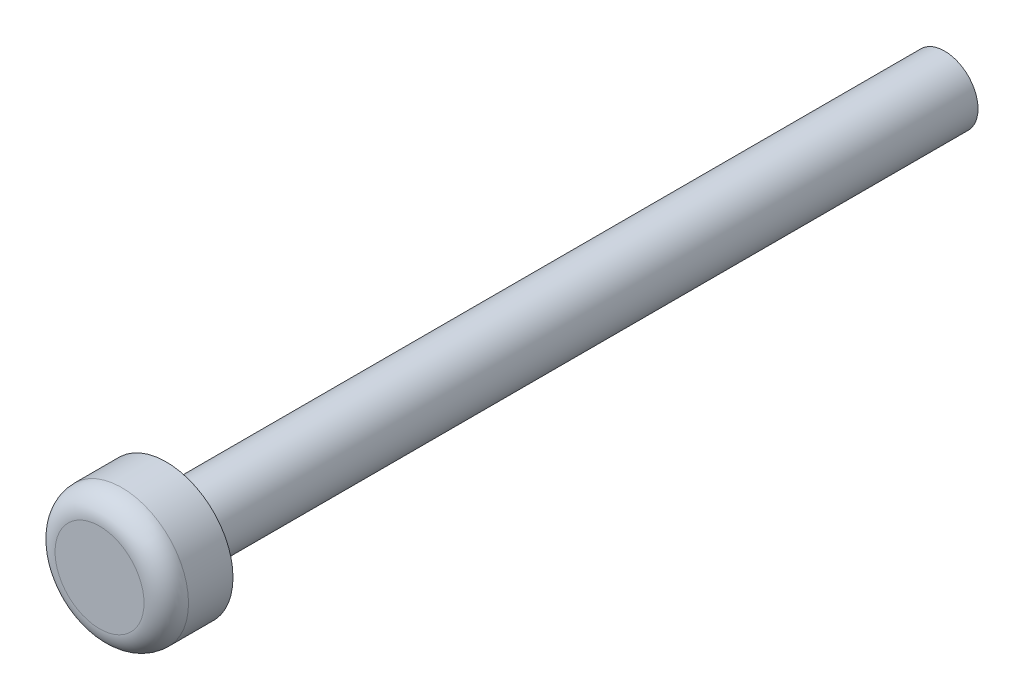
ISO-10303-21;
HEADER;
FILE_DESCRIPTION(('STEP AP214'),'2;1');
FILE_NAME('part.step','',(''),(''),'','','');
FILE_SCHEMA(('AUTOMOTIVE_DESIGN { 1 0 10303 214 1 1 1 1 }'));
ENDSEC;
DATA;
#1=APPLICATION_CONTEXT('core data for automotive mechanical design processes');
#2=APPLICATION_PROTOCOL_DEFINITION('international standard','automotive_design',2000,#1);
#3=PRODUCT_CONTEXT('',#1,'mechanical');
#4=PRODUCT('Part','Part','',(#3));
#5=PRODUCT_RELATED_PRODUCT_CATEGORY('part','',(#4));
#6=PRODUCT_DEFINITION_FORMATION('','',#4);
#7=PRODUCT_DEFINITION_CONTEXT('part definition',#1,'design');
#8=PRODUCT_DEFINITION('design','',#6,#7);
#9=PRODUCT_DEFINITION_SHAPE('','',#8);
#10=(LENGTH_UNIT() NAMED_UNIT(*) SI_UNIT(.MILLI.,.METRE.));
#11=(NAMED_UNIT(*) PLANE_ANGLE_UNIT() SI_UNIT($,.RADIAN.));
#12=(NAMED_UNIT(*) SI_UNIT($,.STERADIAN.) SOLID_ANGLE_UNIT());
#13=UNCERTAINTY_MEASURE_WITH_UNIT(LENGTH_MEASURE(1.E-05),#10,'distance_accuracy_value','');
#14=(GEOMETRIC_REPRESENTATION_CONTEXT(3) GLOBAL_UNCERTAINTY_ASSIGNED_CONTEXT((#13)) GLOBAL_UNIT_ASSIGNED_CONTEXT((#10,
#11,#12)) REPRESENTATION_CONTEXT('',''));
#15=CARTESIAN_POINT('',(0.,0.,0.));
#16=DIRECTION('',(0.,0.,1.));
#17=DIRECTION('',(1.,0.,0.));
#18=AXIS2_PLACEMENT_3D('',#15,#16,#17);
#19=CARTESIAN_POINT('',(0.,0.,-35.));
#20=DIRECTION('',(0.,0.,1.));
#21=DIRECTION('',(1.,0.,0.));
#22=AXIS2_PLACEMENT_3D('',#19,#20,#21);
#23=CYLINDRICAL_SURFACE('',#22,1.5);
#24=CARTESIAN_POINT('',(0.,0.,-35.));
#25=DIRECTION('',(0.,0.,1.));
#26=DIRECTION('',(1.,0.,0.));
#27=AXIS2_PLACEMENT_3D('',#24,#25,#26);
#28=CIRCLE('',#27,1.5);
#29=CARTESIAN_POINT('',(1.5,0.,-35.));
#30=VERTEX_POINT('',#29);
#31=EDGE_CURVE('E42',#30,#30,#28,.T.);
#32=ORIENTED_EDGE('',*,*,#31,.T.);
#33=EDGE_LOOP('',(#32));
#34=FACE_BOUND('',#33,.T.);
#35=CARTESIAN_POINT('',(0.,0.,0.));
#36=DIRECTION('',(0.,0.,1.));
#37=DIRECTION('',(1.,0.,0.));
#38=AXIS2_PLACEMENT_3D('',#35,#36,#37);
#39=CIRCLE('',#38,1.5);
#40=CARTESIAN_POINT('',(1.5,0.,0.));
#41=VERTEX_POINT('',#40);
#42=EDGE_CURVE('E46',#41,#41,#39,.T.);
#43=ORIENTED_EDGE('',*,*,#42,.F.);
#44=EDGE_LOOP('',(#43));
#45=FACE_BOUND('',#44,.T.);
#46=ADVANCED_FACE('F31',(#34,#45),#23,.T.);
#47=CARTESIAN_POINT('',(0.,0.,-35.));
#48=DIRECTION('',(0.,0.,1.));
#49=DIRECTION('',(1.,0.,0.));
#50=AXIS2_PLACEMENT_3D('',#47,#48,#49);
#51=PLANE('',#50);
#52=ORIENTED_EDGE('',*,*,#31,.F.);
#53=EDGE_LOOP('',(#52));
#54=FACE_BOUND('',#53,.T.);
#55=ADVANCED_FACE('F70',(#54),#51,.F.);
#56=CARTESIAN_POINT('',(0.,0.,3.));
#57=DIRECTION('',(0.,0.,-1.));
#58=DIRECTION('',(-1.,0.,0.));
#59=AXIS2_PLACEMENT_3D('',#56,#57,#58);
#60=CYLINDRICAL_SURFACE('',#59,3.);
#61=CARTESIAN_POINT('',(0.,0.,2.));
#62=DIRECTION('',(0.,0.,1.));
#63=DIRECTION('',(1.,0.,0.));
#64=AXIS2_PLACEMENT_3D('',#61,#62,#63);
#65=CIRCLE('',#64,3.);
#66=CARTESIAN_POINT('',(3.,0.,2.));
#67=VERTEX_POINT('',#66);
#68=EDGE_CURVE('E10',#67,#67,#65,.F.);
#69=ORIENTED_EDGE('',*,*,#68,.T.);
#70=EDGE_LOOP('',(#69));
#71=FACE_BOUND('',#70,.T.);
#72=CARTESIAN_POINT('',(0.,0.,0.));
#73=DIRECTION('',(0.,0.,1.));
#74=DIRECTION('',(1.,0.,0.));
#75=AXIS2_PLACEMENT_3D('',#72,#73,#74);
#76=CIRCLE('',#75,3.);
#77=CARTESIAN_POINT('',(3.,0.,0.));
#78=VERTEX_POINT('',#77);
#79=EDGE_CURVE('E50',#78,#78,#76,.T.);
#80=ORIENTED_EDGE('',*,*,#79,.T.);
#81=EDGE_LOOP('',(#80));
#82=FACE_BOUND('',#81,.T.);
#83=ADVANCED_FACE('F55',(#71,#82),#60,.T.);
#84=CARTESIAN_POINT('',(0.,0.,3.));
#85=DIRECTION('',(0.,0.,1.));
#86=DIRECTION('',(1.,0.,0.));
#87=AXIS2_PLACEMENT_3D('',#84,#85,#86);
#88=PLANE('',#87);
#89=CARTESIAN_POINT('',(0.,0.,3.));
#90=DIRECTION('',(0.,0.,1.));
#91=DIRECTION('',(1.,0.,0.));
#92=AXIS2_PLACEMENT_3D('',#89,#90,#91);
#93=CIRCLE('',#92,2.);
#94=CARTESIAN_POINT('',(2.,0.,3.));
#95=VERTEX_POINT('',#94);
#96=EDGE_CURVE('E38',#95,#95,#93,.T.);
#97=ORIENTED_EDGE('',*,*,#96,.T.);
#98=EDGE_LOOP('',(#97));
#99=FACE_BOUND('',#98,.T.);
#100=ADVANCED_FACE('F59',(#99),#88,.T.);
#101=CARTESIAN_POINT('',(0.,0.,0.));
#102=DIRECTION('',(0.,0.,1.));
#103=DIRECTION('',(1.,0.,0.));
#104=AXIS2_PLACEMENT_3D('',#101,#102,#103);
#105=PLANE('',#104);
#106=ORIENTED_EDGE('',*,*,#42,.T.);
#107=EDGE_LOOP('',(#106));
#108=FACE_BOUND('',#107,.T.);
#109=ORIENTED_EDGE('',*,*,#79,.F.);
#110=EDGE_LOOP('',(#109));
#111=FACE_BOUND('',#110,.T.);
#112=ADVANCED_FACE('F57',(#108,#111),#105,.F.);
#113=CARTESIAN_POINT('',(0.,0.,2.));
#114=DIRECTION('',(0.,0.,1.));
#115=DIRECTION('',(1.,0.,0.));
#116=AXIS2_PLACEMENT_3D('',#113,#114,#115);
#117=TOROIDAL_SURFACE('',#116,2.,1.);
#118=ORIENTED_EDGE('',*,*,#68,.F.);
#119=EDGE_LOOP('',(#118));
#120=FACE_BOUND('',#119,.T.);
#121=ORIENTED_EDGE('',*,*,#96,.F.);
#122=EDGE_LOOP('',(#121));
#123=FACE_BOUND('',#122,.T.);
#124=ADVANCED_FACE('F33',(#120,#123),#117,.T.);
#125=CLOSED_SHELL('',(#46,#55,#83,#100,#112,#124));
#126=MANIFOLD_SOLID_BREP('B2',#125);
#127=ADVANCED_BREP_SHAPE_REPRESENTATION('',(#18,#126),#14);
#128=SHAPE_DEFINITION_REPRESENTATION(#9,#127);
ENDSEC;
END-ISO-10303-21;
